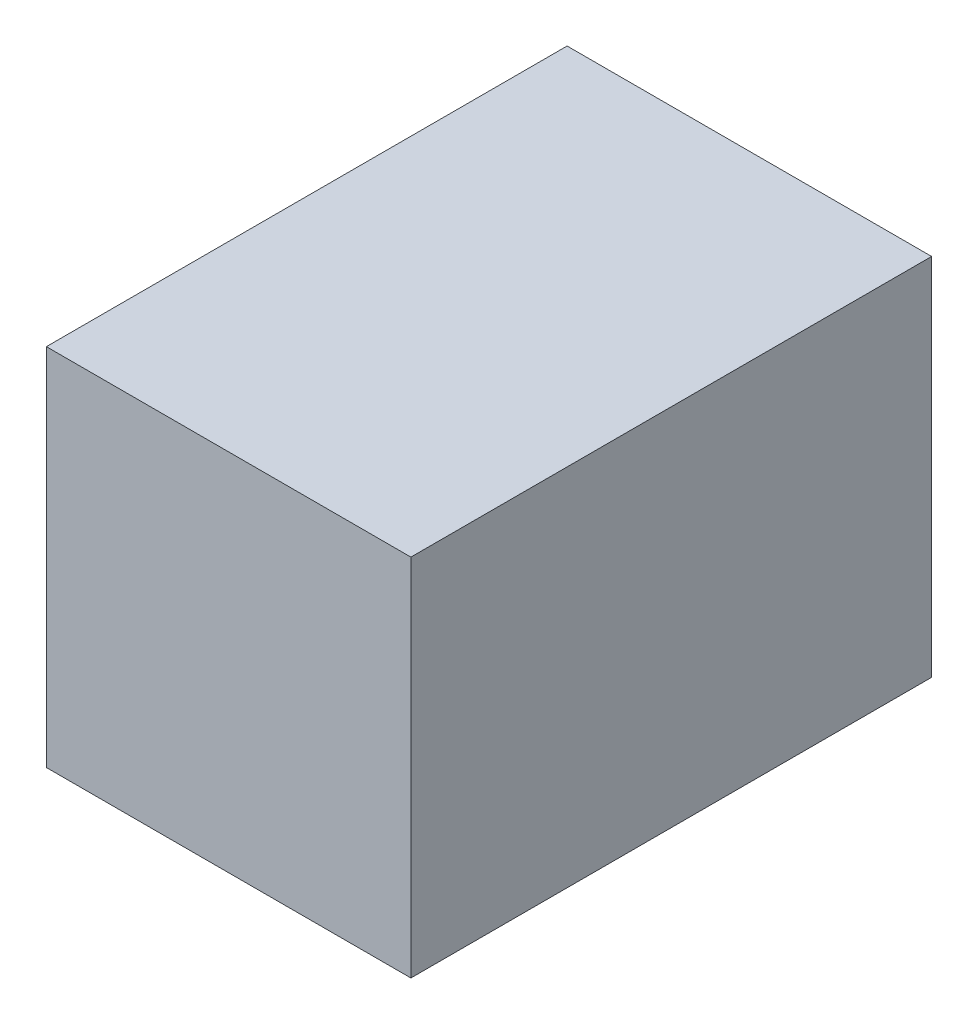
ISO-10303-21;
HEADER;
FILE_DESCRIPTION(('STEP AP214'),'2;1');
FILE_NAME('part.step','',(''),(''),'','','');
FILE_SCHEMA(('AUTOMOTIVE_DESIGN { 1 0 10303 214 1 1 1 1 }'));
ENDSEC;
DATA;
#1=APPLICATION_CONTEXT('core data for automotive mechanical design processes');
#2=APPLICATION_PROTOCOL_DEFINITION('international standard','automotive_design',2000,#1);
#3=PRODUCT_CONTEXT('',#1,'mechanical');
#4=PRODUCT('Part','Part','',(#3));
#5=PRODUCT_RELATED_PRODUCT_CATEGORY('part','',(#4));
#6=PRODUCT_DEFINITION_FORMATION('','',#4);
#7=PRODUCT_DEFINITION_CONTEXT('part definition',#1,'design');
#8=PRODUCT_DEFINITION('design','',#6,#7);
#9=PRODUCT_DEFINITION_SHAPE('','',#8);
#10=(LENGTH_UNIT() NAMED_UNIT(*) SI_UNIT(.MILLI.,.METRE.));
#11=(NAMED_UNIT(*) PLANE_ANGLE_UNIT() SI_UNIT($,.RADIAN.));
#12=(NAMED_UNIT(*) SI_UNIT($,.STERADIAN.) SOLID_ANGLE_UNIT());
#13=UNCERTAINTY_MEASURE_WITH_UNIT(LENGTH_MEASURE(1.E-05),#10,'distance_accuracy_value','');
#14=(GEOMETRIC_REPRESENTATION_CONTEXT(3) GLOBAL_UNCERTAINTY_ASSIGNED_CONTEXT((#13)) GLOBAL_UNIT_ASSIGNED_CONTEXT((#10,
#11,#12)) REPRESENTATION_CONTEXT('',''));
#15=CARTESIAN_POINT('',(0.,0.,0.));
#16=DIRECTION('',(0.,0.,1.));
#17=DIRECTION('',(1.,0.,0.));
#18=AXIS2_PLACEMENT_3D('',#15,#16,#17);
#19=CARTESIAN_POINT('',(17.5,17.5,50.));
#20=DIRECTION('',(-1.,0.,0.));
#21=DIRECTION('',(0.,-1.,0.));
#22=AXIS2_PLACEMENT_3D('',#19,#20,#21);
#23=PLANE('',#22);
#24=DIRECTION('',(0.,1.,0.));
#25=VECTOR('',#24,1.);
#26=CARTESIAN_POINT('',(17.5,17.5,0.));
#27=LINE('',#26,#25);
#28=CARTESIAN_POINT('',(17.5,-17.5,0.));
#29=VERTEX_POINT('',#28);
#30=CARTESIAN_POINT('',(17.5,17.5,0.));
#31=VERTEX_POINT('',#30);
#32=EDGE_CURVE('E96',#29,#31,#27,.T.);
#33=ORIENTED_EDGE('',*,*,#32,.T.);
#34=DIRECTION('',(0.,0.,-1.));
#35=VECTOR('',#34,1.);
#36=CARTESIAN_POINT('',(17.5,17.5,50.));
#37=LINE('',#36,#35);
#38=CARTESIAN_POINT('',(17.5,17.5,50.));
#39=VERTEX_POINT('',#38);
#40=EDGE_CURVE('E11',#39,#31,#37,.T.);
#41=ORIENTED_EDGE('',*,*,#40,.F.);
#42=DIRECTION('',(0.,1.,0.));
#43=VECTOR('',#42,1.);
#44=CARTESIAN_POINT('',(17.5,17.5,50.));
#45=LINE('',#44,#43);
#46=CARTESIAN_POINT('',(17.5,-17.5,50.));
#47=VERTEX_POINT('',#46);
#48=EDGE_CURVE('E84',#47,#39,#45,.T.);
#49=ORIENTED_EDGE('',*,*,#48,.F.);
#50=DIRECTION('',(0.,0.,-1.));
#51=VECTOR('',#50,1.);
#52=CARTESIAN_POINT('',(17.5,-17.5,50.));
#53=LINE('',#52,#51);
#54=EDGE_CURVE('E92',#47,#29,#53,.T.);
#55=ORIENTED_EDGE('',*,*,#54,.T.);
#56=EDGE_LOOP('',(#33,#41,#49,#55));
#57=FACE_BOUND('',#56,.T.);
#58=ADVANCED_FACE('F33',(#57),#23,.F.);
#59=CARTESIAN_POINT('',(-17.5,17.5,50.));
#60=DIRECTION('',(0.,-1.,0.));
#61=DIRECTION('',(0.,0.,-1.));
#62=AXIS2_PLACEMENT_3D('',#59,#60,#61);
#63=PLANE('',#62);
#64=DIRECTION('',(-1.,0.,0.));
#65=VECTOR('',#64,1.);
#66=CARTESIAN_POINT('',(-17.5,17.5,0.));
#67=LINE('',#66,#65);
#68=CARTESIAN_POINT('',(-17.5,17.5,0.));
#69=VERTEX_POINT('',#68);
#70=EDGE_CURVE('E88',#31,#69,#67,.T.);
#71=ORIENTED_EDGE('',*,*,#70,.T.);
#72=DIRECTION('',(0.,0.,-1.));
#73=VECTOR('',#72,1.);
#74=CARTESIAN_POINT('',(-17.5,17.5,50.));
#75=LINE('',#74,#73);
#76=CARTESIAN_POINT('',(-17.5,17.5,50.));
#77=VERTEX_POINT('',#76);
#78=EDGE_CURVE('E41',#77,#69,#75,.T.);
#79=ORIENTED_EDGE('',*,*,#78,.F.);
#80=DIRECTION('',(-1.,0.,0.));
#81=VECTOR('',#80,1.);
#82=CARTESIAN_POINT('',(-17.5,17.5,50.));
#83=LINE('',#82,#81);
#84=EDGE_CURVE('E79',#39,#77,#83,.T.);
#85=ORIENTED_EDGE('',*,*,#84,.F.);
#86=ORIENTED_EDGE('',*,*,#40,.T.);
#87=EDGE_LOOP('',(#71,#79,#85,#86));
#88=FACE_BOUND('',#87,.T.);
#89=ADVANCED_FACE('F87',(#88),#63,.F.);
#90=CARTESIAN_POINT('',(-17.5,17.5,50.));
#91=DIRECTION('',(1.,0.,0.));
#92=DIRECTION('',(0.,1.,0.));
#93=AXIS2_PLACEMENT_3D('',#90,#91,#92);
#94=PLANE('',#93);
#95=DIRECTION('',(0.,-1.,0.));
#96=VECTOR('',#95,1.);
#97=CARTESIAN_POINT('',(-17.5,17.5,0.));
#98=LINE('',#97,#96);
#99=CARTESIAN_POINT('',(-17.5,-17.5,0.));
#100=VERTEX_POINT('',#99);
#101=EDGE_CURVE('E66',#69,#100,#98,.T.);
#102=ORIENTED_EDGE('',*,*,#101,.T.);
#103=DIRECTION('',(0.,0.,-1.));
#104=VECTOR('',#103,1.);
#105=CARTESIAN_POINT('',(-17.5,-17.5,50.));
#106=LINE('',#105,#104);
#107=CARTESIAN_POINT('',(-17.5,-17.5,50.));
#108=VERTEX_POINT('',#107);
#109=EDGE_CURVE('E89',#108,#100,#106,.T.);
#110=ORIENTED_EDGE('',*,*,#109,.F.);
#111=DIRECTION('',(0.,-1.,0.));
#112=VECTOR('',#111,1.);
#113=CARTESIAN_POINT('',(-17.5,17.5,50.));
#114=LINE('',#113,#112);
#115=EDGE_CURVE('E82',#77,#108,#114,.T.);
#116=ORIENTED_EDGE('',*,*,#115,.F.);
#117=ORIENTED_EDGE('',*,*,#78,.T.);
#118=EDGE_LOOP('',(#102,#110,#116,#117));
#119=FACE_BOUND('',#118,.T.);
#120=ADVANCED_FACE('F90',(#119),#94,.F.);
#121=CARTESIAN_POINT('',(-17.5,-17.5,50.));
#122=DIRECTION('',(0.,1.,0.));
#123=DIRECTION('',(0.,0.,1.));
#124=AXIS2_PLACEMENT_3D('',#121,#122,#123);
#125=PLANE('',#124);
#126=DIRECTION('',(1.,0.,0.));
#127=VECTOR('',#126,1.);
#128=CARTESIAN_POINT('',(-17.5,-17.5,0.));
#129=LINE('',#128,#127);
#130=EDGE_CURVE('E72',#100,#29,#129,.T.);
#131=ORIENTED_EDGE('',*,*,#130,.T.);
#132=ORIENTED_EDGE('',*,*,#54,.F.);
#133=DIRECTION('',(1.,0.,0.));
#134=VECTOR('',#133,1.);
#135=CARTESIAN_POINT('',(-17.5,-17.5,50.));
#136=LINE('',#135,#134);
#137=EDGE_CURVE('E49',#108,#47,#136,.T.);
#138=ORIENTED_EDGE('',*,*,#137,.F.);
#139=ORIENTED_EDGE('',*,*,#109,.T.);
#140=EDGE_LOOP('',(#131,#132,#138,#139));
#141=FACE_BOUND('',#140,.T.);
#142=ADVANCED_FACE('F103',(#141),#125,.F.);
#143=CARTESIAN_POINT('',(0.,0.,50.));
#144=DIRECTION('',(0.,0.,1.));
#145=DIRECTION('',(1.,0.,0.));
#146=AXIS2_PLACEMENT_3D('',#143,#144,#145);
#147=PLANE('',#146);
#148=ORIENTED_EDGE('',*,*,#48,.T.);
#149=ORIENTED_EDGE('',*,*,#84,.T.);
#150=ORIENTED_EDGE('',*,*,#115,.T.);
#151=ORIENTED_EDGE('',*,*,#137,.T.);
#152=EDGE_LOOP('',(#148,#149,#150,#151));
#153=FACE_BOUND('',#152,.T.);
#154=ADVANCED_FACE('F80',(#153),#147,.T.);
#155=CARTESIAN_POINT('',(0.,0.,0.));
#156=DIRECTION('',(0.,0.,1.));
#157=DIRECTION('',(1.,0.,0.));
#158=AXIS2_PLACEMENT_3D('',#155,#156,#157);
#159=PLANE('',#158);
#160=ORIENTED_EDGE('',*,*,#32,.F.);
#161=ORIENTED_EDGE('',*,*,#130,.F.);
#162=ORIENTED_EDGE('',*,*,#101,.F.);
#163=ORIENTED_EDGE('',*,*,#70,.F.);
#164=EDGE_LOOP('',(#160,#161,#162,#163));
#165=FACE_BOUND('',#164,.T.);
#166=ADVANCED_FACE('F106',(#165),#159,.F.);
#167=CLOSED_SHELL('',(#58,#89,#120,#142,#154,#166));
#168=MANIFOLD_SOLID_BREP('B2',#167);
#169=ADVANCED_BREP_SHAPE_REPRESENTATION('',(#18,#168),#14);
#170=SHAPE_DEFINITION_REPRESENTATION(#9,#169);
ENDSEC;
END-ISO-10303-21;
